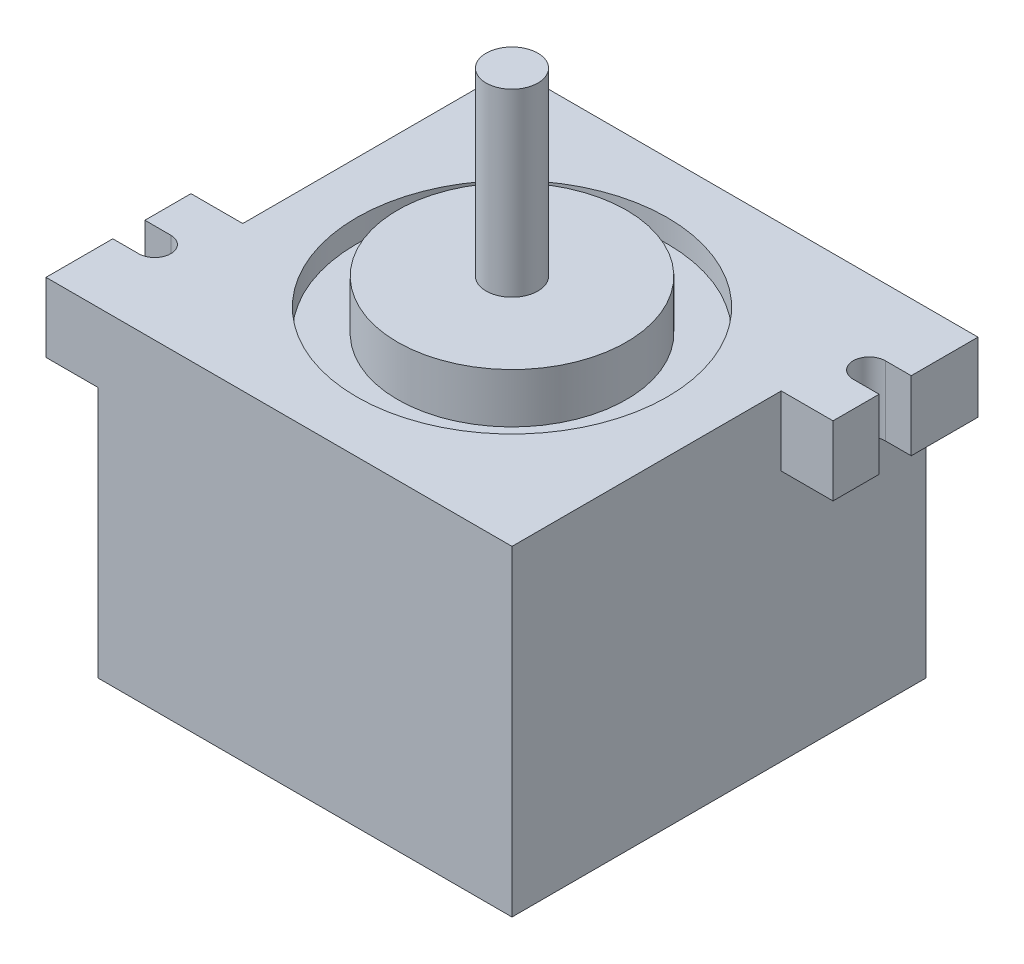
ISO-10303-21;
HEADER;
FILE_DESCRIPTION(('STEP AP214'),'2;1');
FILE_NAME('part.step','',(''),(''),'','','');
FILE_SCHEMA(('AUTOMOTIVE_DESIGN { 1 0 10303 214 1 1 1 1 }'));
ENDSEC;
DATA;
#1=APPLICATION_CONTEXT('core data for automotive mechanical design processes');
#2=APPLICATION_PROTOCOL_DEFINITION('international standard','automotive_design',2000,#1);
#3=PRODUCT_CONTEXT('',#1,'mechanical');
#4=PRODUCT('Part','Part','',(#3));
#5=PRODUCT_RELATED_PRODUCT_CATEGORY('part','',(#4));
#6=PRODUCT_DEFINITION_FORMATION('','',#4);
#7=PRODUCT_DEFINITION_CONTEXT('part definition',#1,'design');
#8=PRODUCT_DEFINITION('design','',#6,#7);
#9=PRODUCT_DEFINITION_SHAPE('','',#8);
#10=(LENGTH_UNIT() NAMED_UNIT(*) SI_UNIT(.MILLI.,.METRE.));
#11=(NAMED_UNIT(*) PLANE_ANGLE_UNIT() SI_UNIT($,.RADIAN.));
#12=(NAMED_UNIT(*) SI_UNIT($,.STERADIAN.) SOLID_ANGLE_UNIT());
#13=UNCERTAINTY_MEASURE_WITH_UNIT(LENGTH_MEASURE(1.E-05),#10,'distance_accuracy_value','');
#14=(GEOMETRIC_REPRESENTATION_CONTEXT(3) GLOBAL_UNCERTAINTY_ASSIGNED_CONTEXT((#13)) GLOBAL_UNIT_ASSIGNED_CONTEXT((#10,
#11,#12)) REPRESENTATION_CONTEXT('',''));
#15=CARTESIAN_POINT('',(0.,0.,0.));
#16=DIRECTION('',(0.,0.,1.));
#17=DIRECTION('',(1.,0.,0.));
#18=AXIS2_PLACEMENT_3D('',#15,#16,#17);
#19=CARTESIAN_POINT('',(0.,0.,-40.));
#20=DIRECTION('',(0.,-1.,0.));
#21=DIRECTION('',(0.,0.,-1.));
#22=AXIS2_PLACEMENT_3D('',#19,#20,#21);
#23=PLANE('',#22);
#24=DIRECTION('',(0.,0.,1.));
#25=VECTOR('',#24,1.);
#26=CARTESIAN_POINT('',(0.,0.,0.));
#27=LINE('',#26,#25);
#28=CARTESIAN_POINT('',(0.,0.,-40.));
#29=VERTEX_POINT('',#28);
#30=CARTESIAN_POINT('',(0.,0.,0.));
#31=VERTEX_POINT('',#30);
#32=EDGE_CURVE('E367',#29,#31,#27,.T.);
#33=ORIENTED_EDGE('',*,*,#32,.F.);
#34=DIRECTION('',(-1.,0.,0.));
#35=VECTOR('',#34,1.);
#36=CARTESIAN_POINT('',(0.,0.,-40.));
#37=LINE('',#36,#35);
#38=CARTESIAN_POINT('',(40.,0.,-40.));
#39=VERTEX_POINT('',#38);
#40=EDGE_CURVE('E360',#39,#29,#37,.T.);
#41=ORIENTED_EDGE('',*,*,#40,.F.);
#42=DIRECTION('',(0.,0.,-1.));
#43=VECTOR('',#42,1.);
#44=CARTESIAN_POINT('',(40.,0.,0.));
#45=LINE('',#44,#43);
#46=CARTESIAN_POINT('',(40.,0.,0.));
#47=VERTEX_POINT('',#46);
#48=EDGE_CURVE('E362',#47,#39,#45,.T.);
#49=ORIENTED_EDGE('',*,*,#48,.F.);
#50=DIRECTION('',(1.,0.,0.));
#51=VECTOR('',#50,1.);
#52=CARTESIAN_POINT('',(0.,0.,0.));
#53=LINE('',#52,#51);
#54=EDGE_CURVE('E365',#31,#47,#53,.T.);
#55=ORIENTED_EDGE('',*,*,#54,.F.);
#56=EDGE_LOOP('',(#33,#41,#49,#55));
#57=FACE_BOUND('',#56,.T.);
#58=CARTESIAN_POINT('',(20.,0.,-20.));
#59=DIRECTION('',(0.,-1.,0.));
#60=DIRECTION('',(0.,0.,-1.));
#61=AXIS2_PLACEMENT_3D('',#58,#59,#60);
#62=CIRCLE('',#61,2.5);
#63=CARTESIAN_POINT('',(20.,0.,-22.5));
#64=VERTEX_POINT('',#63);
#65=EDGE_CURVE('E459',#64,#64,#62,.T.);
#66=ORIENTED_EDGE('',*,*,#65,.F.);
#67=EDGE_LOOP('',(#66));
#68=FACE_BOUND('',#67,.T.);
#69=ADVANCED_FACE('F38',(#57,#68),#23,.T.);
#70=CARTESIAN_POINT('',(20.,33.6,-20.));
#71=DIRECTION('',(0.,1.,0.));
#72=DIRECTION('',(0.,0.,1.));
#73=AXIS2_PLACEMENT_3D('',#70,#71,#72);
#74=PLANE('',#73);
#75=CARTESIAN_POINT('',(20.,33.6,-20.));
#76=DIRECTION('',(0.,1.,0.));
#77=DIRECTION('',(0.,0.,1.));
#78=AXIS2_PLACEMENT_3D('',#75,#76,#77);
#79=CIRCLE('',#78,11.05);
#80=CARTESIAN_POINT('',(20.,33.6,-8.95));
#81=VERTEX_POINT('',#80);
#82=EDGE_CURVE('E380',#81,#81,#79,.T.);
#83=ORIENTED_EDGE('',*,*,#82,.T.);
#84=EDGE_LOOP('',(#83));
#85=FACE_BOUND('',#84,.T.);
#86=CARTESIAN_POINT('',(20.,33.6,-20.));
#87=DIRECTION('',(0.,1.,0.));
#88=DIRECTION('',(0.,0.,1.));
#89=AXIS2_PLACEMENT_3D('',#86,#87,#88);
#90=CIRCLE('',#89,2.5);
#91=CARTESIAN_POINT('',(20.,33.6,-17.5));
#92=VERTEX_POINT('',#91);
#93=EDGE_CURVE('E310',#92,#92,#90,.T.);
#94=ORIENTED_EDGE('',*,*,#93,.F.);
#95=EDGE_LOOP('',(#94));
#96=FACE_BOUND('',#95,.T.);
#97=ADVANCED_FACE('F418',(#85,#96),#74,.T.);
#98=CARTESIAN_POINT('',(20.,28.8,-20.));
#99=DIRECTION('',(0.,1.,0.));
#100=DIRECTION('',(0.,0.,1.));
#101=AXIS2_PLACEMENT_3D('',#98,#99,#100);
#102=PLANE('',#101);
#103=CARTESIAN_POINT('',(20.,28.8,-20.));
#104=DIRECTION('',(0.,1.,0.));
#105=DIRECTION('',(0.,0.,1.));
#106=AXIS2_PLACEMENT_3D('',#103,#104,#105);
#107=CIRCLE('',#106,15.);
#108=CARTESIAN_POINT('',(20.,28.8,-5.));
#109=VERTEX_POINT('',#108);
#110=EDGE_CURVE('E369',#109,#109,#107,.T.);
#111=ORIENTED_EDGE('',*,*,#110,.T.);
#112=EDGE_LOOP('',(#111));
#113=FACE_BOUND('',#112,.T.);
#114=CARTESIAN_POINT('',(20.,28.8,-20.));
#115=DIRECTION('',(0.,1.,0.));
#116=DIRECTION('',(0.,0.,1.));
#117=AXIS2_PLACEMENT_3D('',#114,#115,#116);
#118=CIRCLE('',#117,11.05);
#119=CARTESIAN_POINT('',(20.,28.8,-8.95));
#120=VERTEX_POINT('',#119);
#121=EDGE_CURVE('E384',#120,#120,#118,.T.);
#122=ORIENTED_EDGE('',*,*,#121,.F.);
#123=EDGE_LOOP('',(#122));
#124=FACE_BOUND('',#123,.T.);
#125=ADVANCED_FACE('F424',(#113,#124),#102,.T.);
#126=CARTESIAN_POINT('',(0.,31.,0.));
#127=DIRECTION('',(1.,0.,0.));
#128=DIRECTION('',(0.,0.,-1.));
#129=AXIS2_PLACEMENT_3D('',#126,#127,#128);
#130=PLANE('',#129);
#131=DIRECTION('',(0.,-1.,0.));
#132=VECTOR('',#131,1.);
#133=CARTESIAN_POINT('',(0.,31.,0.));
#134=LINE('',#133,#132);
#135=CARTESIAN_POINT('',(0.,24.3,0.));
#136=VERTEX_POINT('',#135);
#137=EDGE_CURVE('E11',#136,#31,#134,.T.);
#138=ORIENTED_EDGE('',*,*,#137,.F.);
#139=DIRECTION('',(0.,0.,-1.));
#140=VECTOR('',#139,1.);
#141=CARTESIAN_POINT('',(0.,24.3,0.));
#142=LINE('',#141,#140);
#143=CARTESIAN_POINT('',(0.,24.3,-14.));
#144=VERTEX_POINT('',#143);
#145=EDGE_CURVE('E199',#136,#144,#142,.T.);
#146=ORIENTED_EDGE('',*,*,#145,.T.);
#147=DIRECTION('',(0.,1.,0.));
#148=VECTOR('',#147,1.);
#149=CARTESIAN_POINT('',(0.,24.3,-14.));
#150=LINE('',#149,#148);
#151=CARTESIAN_POINT('',(0.,31.,-14.));
#152=VERTEX_POINT('',#151);
#153=EDGE_CURVE('E183',#144,#152,#150,.T.);
#154=ORIENTED_EDGE('',*,*,#153,.T.);
#155=DIRECTION('',(0.,0.,1.));
#156=VECTOR('',#155,1.);
#157=CARTESIAN_POINT('',(0.,31.,0.));
#158=LINE('',#157,#156);
#159=CARTESIAN_POINT('',(0.,31.,-40.));
#160=VERTEX_POINT('',#159);
#161=EDGE_CURVE('E343',#160,#152,#158,.T.);
#162=ORIENTED_EDGE('',*,*,#161,.F.);
#163=DIRECTION('',(0.,-1.,0.));
#164=VECTOR('',#163,1.);
#165=CARTESIAN_POINT('',(0.,31.,-40.));
#166=LINE('',#165,#164);
#167=EDGE_CURVE('E352',#160,#29,#166,.T.);
#168=ORIENTED_EDGE('',*,*,#167,.T.);
#169=ORIENTED_EDGE('',*,*,#32,.T.);
#170=EDGE_LOOP('',(#138,#146,#154,#162,#168,#169));
#171=FACE_BOUND('',#170,.T.);
#172=ADVANCED_FACE('F40',(#171),#130,.F.);
#173=CARTESIAN_POINT('',(0.,31.,0.));
#174=DIRECTION('',(0.,0.,-1.));
#175=DIRECTION('',(-1.,0.,0.));
#176=AXIS2_PLACEMENT_3D('',#173,#174,#175);
#177=PLANE('',#176);
#178=ORIENTED_EDGE('',*,*,#54,.T.);
#179=DIRECTION('',(0.,-1.,0.));
#180=VECTOR('',#179,1.);
#181=CARTESIAN_POINT('',(40.,31.,0.));
#182=LINE('',#181,#180);
#183=CARTESIAN_POINT('',(40.,31.,0.));
#184=VERTEX_POINT('',#183);
#185=EDGE_CURVE('E48',#184,#47,#182,.T.);
#186=ORIENTED_EDGE('',*,*,#185,.F.);
#187=DIRECTION('',(1.,0.,0.));
#188=VECTOR('',#187,1.);
#189=CARTESIAN_POINT('',(0.,31.,0.));
#190=LINE('',#189,#188);
#191=CARTESIAN_POINT('',(-5.,31.,0.));
#192=VERTEX_POINT('',#191);
#193=EDGE_CURVE('E372',#192,#184,#190,.T.);
#194=ORIENTED_EDGE('',*,*,#193,.F.);
#195=DIRECTION('',(0.,1.,0.));
#196=VECTOR('',#195,1.);
#197=CARTESIAN_POINT('',(-5.,24.3,0.));
#198=LINE('',#197,#196);
#199=CARTESIAN_POINT('',(-5.,24.3,0.));
#200=VERTEX_POINT('',#199);
#201=EDGE_CURVE('E252',#200,#192,#198,.T.);
#202=ORIENTED_EDGE('',*,*,#201,.F.);
#203=DIRECTION('',(1.,0.,0.));
#204=VECTOR('',#203,1.);
#205=CARTESIAN_POINT('',(0.,24.3,0.));
#206=LINE('',#205,#204);
#207=EDGE_CURVE('E193',#200,#136,#206,.T.);
#208=ORIENTED_EDGE('',*,*,#207,.T.);
#209=ORIENTED_EDGE('',*,*,#137,.T.);
#210=EDGE_LOOP('',(#178,#186,#194,#202,#208,#209));
#211=FACE_BOUND('',#210,.T.);
#212=ADVANCED_FACE('F438',(#211),#177,.F.);
#213=CARTESIAN_POINT('',(40.,31.,0.));
#214=DIRECTION('',(-1.,0.,0.));
#215=DIRECTION('',(0.,0.,1.));
#216=AXIS2_PLACEMENT_3D('',#213,#214,#215);
#217=PLANE('',#216);
#218=DIRECTION('',(0.,-1.,0.));
#219=VECTOR('',#218,1.);
#220=CARTESIAN_POINT('',(40.,31.,-40.));
#221=LINE('',#220,#219);
#222=CARTESIAN_POINT('',(40.,24.3,-40.));
#223=VERTEX_POINT('',#222);
#224=EDGE_CURVE('E350',#223,#39,#221,.T.);
#225=ORIENTED_EDGE('',*,*,#224,.F.);
#226=DIRECTION('',(0.,0.,1.));
#227=VECTOR('',#226,1.);
#228=CARTESIAN_POINT('',(40.,24.3,-40.));
#229=LINE('',#228,#227);
#230=CARTESIAN_POINT('',(40.,24.3,-26.));
#231=VERTEX_POINT('',#230);
#232=EDGE_CURVE('E274',#223,#231,#229,.T.);
#233=ORIENTED_EDGE('',*,*,#232,.T.);
#234=DIRECTION('',(0.,1.,0.));
#235=VECTOR('',#234,1.);
#236=CARTESIAN_POINT('',(40.,24.3,-26.));
#237=LINE('',#236,#235);
#238=CARTESIAN_POINT('',(40.,31.,-26.));
#239=VERTEX_POINT('',#238);
#240=EDGE_CURVE('E322',#231,#239,#237,.T.);
#241=ORIENTED_EDGE('',*,*,#240,.T.);
#242=DIRECTION('',(0.,0.,-1.));
#243=VECTOR('',#242,1.);
#244=CARTESIAN_POINT('',(40.,31.,0.));
#245=LINE('',#244,#243);
#246=EDGE_CURVE('E353',#184,#239,#245,.T.);
#247=ORIENTED_EDGE('',*,*,#246,.F.);
#248=ORIENTED_EDGE('',*,*,#185,.T.);
#249=ORIENTED_EDGE('',*,*,#48,.T.);
#250=EDGE_LOOP('',(#225,#233,#241,#247,#248,#249));
#251=FACE_BOUND('',#250,.T.);
#252=ADVANCED_FACE('F435',(#251),#217,.F.);
#253=CARTESIAN_POINT('',(0.,31.,-40.));
#254=DIRECTION('',(0.,0.,1.));
#255=DIRECTION('',(1.,0.,0.));
#256=AXIS2_PLACEMENT_3D('',#253,#254,#255);
#257=PLANE('',#256);
#258=ORIENTED_EDGE('',*,*,#40,.T.);
#259=ORIENTED_EDGE('',*,*,#167,.F.);
#260=DIRECTION('',(-1.,0.,0.));
#261=VECTOR('',#260,1.);
#262=CARTESIAN_POINT('',(0.,31.,-40.));
#263=LINE('',#262,#261);
#264=CARTESIAN_POINT('',(45.,31.,-40.));
#265=VERTEX_POINT('',#264);
#266=EDGE_CURVE('E359',#265,#160,#263,.T.);
#267=ORIENTED_EDGE('',*,*,#266,.F.);
#268=DIRECTION('',(0.,1.,0.));
#269=VECTOR('',#268,1.);
#270=CARTESIAN_POINT('',(45.,24.3,-40.));
#271=LINE('',#270,#269);
#272=CARTESIAN_POINT('',(45.,24.3,-40.));
#273=VERTEX_POINT('',#272);
#274=EDGE_CURVE('E307',#273,#265,#271,.T.);
#275=ORIENTED_EDGE('',*,*,#274,.F.);
#276=DIRECTION('',(-1.,0.,0.));
#277=VECTOR('',#276,1.);
#278=CARTESIAN_POINT('',(40.,24.3,-40.));
#279=LINE('',#278,#277);
#280=EDGE_CURVE('E290',#273,#223,#279,.T.);
#281=ORIENTED_EDGE('',*,*,#280,.T.);
#282=ORIENTED_EDGE('',*,*,#224,.T.);
#283=EDGE_LOOP('',(#258,#259,#267,#275,#281,#282));
#284=FACE_BOUND('',#283,.T.);
#285=ADVANCED_FACE('F432',(#284),#257,.F.);
#286=CARTESIAN_POINT('',(0.,31.,-40.));
#287=DIRECTION('',(0.,-1.,0.));
#288=DIRECTION('',(0.,0.,-1.));
#289=AXIS2_PLACEMENT_3D('',#286,#287,#288);
#290=PLANE('',#289);
#291=CARTESIAN_POINT('',(20.,31.,-20.));
#292=DIRECTION('',(0.,1.,0.));
#293=DIRECTION('',(0.,0.,1.));
#294=AXIS2_PLACEMENT_3D('',#291,#292,#293);
#295=CIRCLE('',#294,15.);
#296=CARTESIAN_POINT('',(20.,31.,-5.));
#297=VERTEX_POINT('',#296);
#298=EDGE_CURVE('E376',#297,#297,#295,.T.);
#299=ORIENTED_EDGE('',*,*,#298,.F.);
#300=EDGE_LOOP('',(#299));
#301=FACE_BOUND('',#300,.T.);
#302=ORIENTED_EDGE('',*,*,#161,.T.);
#303=DIRECTION('',(-1.,0.,0.));
#304=VECTOR('',#303,1.);
#305=CARTESIAN_POINT('',(0.,31.,-14.));
#306=LINE('',#305,#304);
#307=CARTESIAN_POINT('',(-5.,31.,-14.));
#308=VERTEX_POINT('',#307);
#309=EDGE_CURVE('E59',#152,#308,#306,.T.);
#310=ORIENTED_EDGE('',*,*,#309,.T.);
#311=DIRECTION('',(0.,0.,1.));
#312=VECTOR('',#311,1.);
#313=CARTESIAN_POINT('',(-5.,31.,-9.55));
#314=LINE('',#313,#312);
#315=CARTESIAN_POINT('',(-5.,31.,-9.55));
#316=VERTEX_POINT('',#315);
#317=EDGE_CURVE('E237',#308,#316,#314,.T.);
#318=ORIENTED_EDGE('',*,*,#317,.T.);
#319=DIRECTION('',(1.,0.,0.));
#320=VECTOR('',#319,1.);
#321=CARTESIAN_POINT('',(-2.5,31.,-9.55));
#322=LINE('',#321,#320);
#323=CARTESIAN_POINT('',(-2.5,31.,-9.55));
#324=VERTEX_POINT('',#323);
#325=EDGE_CURVE('E241',#316,#324,#322,.T.);
#326=ORIENTED_EDGE('',*,*,#325,.T.);
#327=CARTESIAN_POINT('',(-2.5,31.,-8.));
#328=DIRECTION('',(0.,-1.,0.));
#329=DIRECTION('',(0.,0.,-1.));
#330=AXIS2_PLACEMENT_3D('',#327,#328,#329);
#331=CIRCLE('',#330,1.55);
#332=CARTESIAN_POINT('',(-2.5,31.,-6.45));
#333=VERTEX_POINT('',#332);
#334=EDGE_CURVE('E245',#324,#333,#331,.T.);
#335=ORIENTED_EDGE('',*,*,#334,.T.);
#336=DIRECTION('',(-1.,0.,0.));
#337=VECTOR('',#336,1.);
#338=CARTESIAN_POINT('',(-2.5,31.,-6.45));
#339=LINE('',#338,#337);
#340=CARTESIAN_POINT('',(-5.,31.,-6.45));
#341=VERTEX_POINT('',#340);
#342=EDGE_CURVE('E214',#333,#341,#339,.T.);
#343=ORIENTED_EDGE('',*,*,#342,.T.);
#344=DIRECTION('',(0.,0.,1.));
#345=VECTOR('',#344,1.);
#346=CARTESIAN_POINT('',(-5.,31.,0.));
#347=LINE('',#346,#345);
#348=EDGE_CURVE('E209',#341,#192,#347,.T.);
#349=ORIENTED_EDGE('',*,*,#348,.T.);
#350=ORIENTED_EDGE('',*,*,#193,.T.);
#351=ORIENTED_EDGE('',*,*,#246,.T.);
#352=DIRECTION('',(1.,0.,0.));
#353=VECTOR('',#352,1.);
#354=CARTESIAN_POINT('',(40.,31.,-26.));
#355=LINE('',#354,#353);
#356=CARTESIAN_POINT('',(45.,31.,-26.));
#357=VERTEX_POINT('',#356);
#358=EDGE_CURVE('E70',#239,#357,#355,.T.);
#359=ORIENTED_EDGE('',*,*,#358,.T.);
#360=DIRECTION('',(0.,0.,-1.));
#361=VECTOR('',#360,1.);
#362=CARTESIAN_POINT('',(45.,31.,-30.45));
#363=LINE('',#362,#361);
#364=CARTESIAN_POINT('',(45.,31.,-30.45));
#365=VERTEX_POINT('',#364);
#366=EDGE_CURVE('E291',#357,#365,#363,.T.);
#367=ORIENTED_EDGE('',*,*,#366,.T.);
#368=DIRECTION('',(-1.,0.,0.));
#369=VECTOR('',#368,1.);
#370=CARTESIAN_POINT('',(42.5,31.,-30.45));
#371=LINE('',#370,#369);
#372=CARTESIAN_POINT('',(42.5,31.,-30.45));
#373=VERTEX_POINT('',#372);
#374=EDGE_CURVE('E295',#365,#373,#371,.T.);
#375=ORIENTED_EDGE('',*,*,#374,.T.);
#376=CARTESIAN_POINT('',(42.5,31.,-32.));
#377=DIRECTION('',(0.,-1.,0.));
#378=DIRECTION('',(0.,0.,1.));
#379=AXIS2_PLACEMENT_3D('',#376,#377,#378);
#380=CIRCLE('',#379,1.55);
#381=CARTESIAN_POINT('',(42.5,31.,-33.55));
#382=VERTEX_POINT('',#381);
#383=EDGE_CURVE('E298',#373,#382,#380,.T.);
#384=ORIENTED_EDGE('',*,*,#383,.T.);
#385=DIRECTION('',(1.,0.,0.));
#386=VECTOR('',#385,1.);
#387=CARTESIAN_POINT('',(42.5,31.,-33.55));
#388=LINE('',#387,#386);
#389=CARTESIAN_POINT('',(45.,31.,-33.55));
#390=VERTEX_POINT('',#389);
#391=EDGE_CURVE('E301',#382,#390,#388,.T.);
#392=ORIENTED_EDGE('',*,*,#391,.T.);
#393=DIRECTION('',(0.,0.,-1.));
#394=VECTOR('',#393,1.);
#395=CARTESIAN_POINT('',(45.,31.,-40.));
#396=LINE('',#395,#394);
#397=EDGE_CURVE('E304',#390,#265,#396,.T.);
#398=ORIENTED_EDGE('',*,*,#397,.T.);
#399=ORIENTED_EDGE('',*,*,#266,.T.);
#400=EDGE_LOOP('',(#302,#310,#318,#326,#335,#343,#349,#350,#351,#359,#367,#375,#384,#392,#398,#399));
#401=FACE_BOUND('',#400,.T.);
#402=ADVANCED_FACE('F430',(#301,#401),#290,.F.);
#403=CARTESIAN_POINT('',(20.,28.8,-20.));
#404=DIRECTION('',(0.,1.,0.));
#405=DIRECTION('',(0.,0.,1.));
#406=AXIS2_PLACEMENT_3D('',#403,#404,#405);
#407=CYLINDRICAL_SURFACE('',#406,15.);
#408=ORIENTED_EDGE('',*,*,#110,.F.);
#409=EDGE_LOOP('',(#408));
#410=FACE_BOUND('',#409,.T.);
#411=ORIENTED_EDGE('',*,*,#298,.T.);
#412=EDGE_LOOP('',(#411));
#413=FACE_BOUND('',#412,.T.);
#414=ADVANCED_FACE('F413',(#410,#413),#407,.F.);
#415=CARTESIAN_POINT('',(20.,33.6,-20.));
#416=DIRECTION('',(0.,-1.,0.));
#417=DIRECTION('',(0.,0.,-1.));
#418=AXIS2_PLACEMENT_3D('',#415,#416,#417);
#419=CYLINDRICAL_SURFACE('',#418,11.05);
#420=ORIENTED_EDGE('',*,*,#82,.F.);
#421=EDGE_LOOP('',(#420));
#422=FACE_BOUND('',#421,.T.);
#423=ORIENTED_EDGE('',*,*,#121,.T.);
#424=EDGE_LOOP('',(#423));
#425=FACE_BOUND('',#424,.T.);
#426=ADVANCED_FACE('F405',(#422,#425),#419,.T.);
#427=CARTESIAN_POINT('',(20.,51.,-20.));
#428=DIRECTION('',(0.,-1.,0.));
#429=DIRECTION('',(0.,0.,-1.));
#430=AXIS2_PLACEMENT_3D('',#427,#428,#429);
#431=CYLINDRICAL_SURFACE('',#430,2.5);
#432=CARTESIAN_POINT('',(20.,51.,-20.));
#433=DIRECTION('',(0.,1.,0.));
#434=DIRECTION('',(0.,0.,1.));
#435=AXIS2_PLACEMENT_3D('',#432,#433,#434);
#436=CIRCLE('',#435,2.5);
#437=CARTESIAN_POINT('',(20.,51.,-17.5));
#438=VERTEX_POINT('',#437);
#439=EDGE_CURVE('E325',#438,#438,#436,.T.);
#440=ORIENTED_EDGE('',*,*,#439,.F.);
#441=EDGE_LOOP('',(#440));
#442=FACE_BOUND('',#441,.T.);
#443=ORIENTED_EDGE('',*,*,#93,.T.);
#444=EDGE_LOOP('',(#443));
#445=FACE_BOUND('',#444,.T.);
#446=ADVANCED_FACE('F403',(#442,#445),#431,.T.);
#447=CARTESIAN_POINT('',(20.,51.,-20.));
#448=DIRECTION('',(0.,1.,0.));
#449=DIRECTION('',(0.,0.,1.));
#450=AXIS2_PLACEMENT_3D('',#447,#448,#449);
#451=PLANE('',#450);
#452=ORIENTED_EDGE('',*,*,#439,.T.);
#453=EDGE_LOOP('',(#452));
#454=FACE_BOUND('',#453,.T.);
#455=ADVANCED_FACE('F401',(#454),#451,.T.);
#456=CARTESIAN_POINT('',(45.,24.3,-40.));
#457=DIRECTION('',(1.,0.,0.));
#458=DIRECTION('',(0.,0.,-1.));
#459=AXIS2_PLACEMENT_3D('',#456,#457,#458);
#460=PLANE('',#459);
#461=ORIENTED_EDGE('',*,*,#397,.F.);
#462=DIRECTION('',(0.,1.,0.));
#463=VECTOR('',#462,1.);
#464=CARTESIAN_POINT('',(45.,24.3,-33.55));
#465=LINE('',#464,#463);
#466=CARTESIAN_POINT('',(45.,24.3,-33.55));
#467=VERTEX_POINT('',#466);
#468=EDGE_CURVE('E311',#467,#390,#465,.T.);
#469=ORIENTED_EDGE('',*,*,#468,.F.);
#470=DIRECTION('',(0.,0.,-1.));
#471=VECTOR('',#470,1.);
#472=CARTESIAN_POINT('',(45.,24.3,-40.));
#473=LINE('',#472,#471);
#474=EDGE_CURVE('E287',#467,#273,#473,.T.);
#475=ORIENTED_EDGE('',*,*,#474,.T.);
#476=ORIENTED_EDGE('',*,*,#274,.T.);
#477=EDGE_LOOP('',(#461,#469,#475,#476));
#478=FACE_BOUND('',#477,.T.);
#479=ADVANCED_FACE('F411',(#478),#460,.T.);
#480=CARTESIAN_POINT('',(42.5,24.3,-33.55));
#481=DIRECTION('',(0.,0.,1.));
#482=DIRECTION('',(1.,0.,0.));
#483=AXIS2_PLACEMENT_3D('',#480,#481,#482);
#484=PLANE('',#483);
#485=ORIENTED_EDGE('',*,*,#391,.F.);
#486=DIRECTION('',(0.,1.,0.));
#487=VECTOR('',#486,1.);
#488=CARTESIAN_POINT('',(42.5,24.3,-33.55));
#489=LINE('',#488,#487);
#490=CARTESIAN_POINT('',(42.5,24.3,-33.55));
#491=VERTEX_POINT('',#490);
#492=EDGE_CURVE('E313',#491,#382,#489,.T.);
#493=ORIENTED_EDGE('',*,*,#492,.F.);
#494=DIRECTION('',(1.,0.,0.));
#495=VECTOR('',#494,1.);
#496=CARTESIAN_POINT('',(42.5,24.3,-33.55));
#497=LINE('',#496,#495);
#498=EDGE_CURVE('E284',#491,#467,#497,.T.);
#499=ORIENTED_EDGE('',*,*,#498,.T.);
#500=ORIENTED_EDGE('',*,*,#468,.T.);
#501=EDGE_LOOP('',(#485,#493,#499,#500));
#502=FACE_BOUND('',#501,.T.);
#503=ADVANCED_FACE('F618',(#502),#484,.T.);
#504=CARTESIAN_POINT('',(42.5,24.3,-32.));
#505=DIRECTION('',(0.,1.,0.));
#506=DIRECTION('',(0.,0.,1.));
#507=AXIS2_PLACEMENT_3D('',#504,#505,#506);
#508=CYLINDRICAL_SURFACE('',#507,1.55);
#509=ORIENTED_EDGE('',*,*,#383,.F.);
#510=DIRECTION('',(0.,1.,0.));
#511=VECTOR('',#510,1.);
#512=CARTESIAN_POINT('',(42.5,24.3,-30.45));
#513=LINE('',#512,#511);
#514=CARTESIAN_POINT('',(42.5,24.3,-30.45));
#515=VERTEX_POINT('',#514);
#516=EDGE_CURVE('E315',#515,#373,#513,.T.);
#517=ORIENTED_EDGE('',*,*,#516,.F.);
#518=CARTESIAN_POINT('',(42.5,24.3,-32.));
#519=DIRECTION('',(0.,-1.,0.));
#520=DIRECTION('',(0.,0.,1.));
#521=AXIS2_PLACEMENT_3D('',#518,#519,#520);
#522=CIRCLE('',#521,1.55);
#523=EDGE_CURVE('E281',#515,#491,#522,.T.);
#524=ORIENTED_EDGE('',*,*,#523,.T.);
#525=ORIENTED_EDGE('',*,*,#492,.T.);
#526=EDGE_LOOP('',(#509,#517,#524,#525));
#527=FACE_BOUND('',#526,.T.);
#528=ADVANCED_FACE('F622',(#527),#508,.F.);
#529=CARTESIAN_POINT('',(42.5,24.3,-30.45));
#530=DIRECTION('',(0.,0.,-1.));
#531=DIRECTION('',(-1.,0.,0.));
#532=AXIS2_PLACEMENT_3D('',#529,#530,#531);
#533=PLANE('',#532);
#534=ORIENTED_EDGE('',*,*,#374,.F.);
#535=DIRECTION('',(0.,1.,0.));
#536=VECTOR('',#535,1.);
#537=CARTESIAN_POINT('',(45.,24.3,-30.45));
#538=LINE('',#537,#536);
#539=CARTESIAN_POINT('',(45.,24.3,-30.45));
#540=VERTEX_POINT('',#539);
#541=EDGE_CURVE('E317',#540,#365,#538,.T.);
#542=ORIENTED_EDGE('',*,*,#541,.F.);
#543=DIRECTION('',(-1.,0.,0.));
#544=VECTOR('',#543,1.);
#545=CARTESIAN_POINT('',(42.5,24.3,-30.45));
#546=LINE('',#545,#544);
#547=EDGE_CURVE('E278',#540,#515,#546,.T.);
#548=ORIENTED_EDGE('',*,*,#547,.T.);
#549=ORIENTED_EDGE('',*,*,#516,.T.);
#550=EDGE_LOOP('',(#534,#542,#548,#549));
#551=FACE_BOUND('',#550,.T.);
#552=ADVANCED_FACE('F626',(#551),#533,.T.);
#553=CARTESIAN_POINT('',(45.,24.3,-30.45));
#554=DIRECTION('',(1.,0.,0.));
#555=DIRECTION('',(0.,0.,-1.));
#556=AXIS2_PLACEMENT_3D('',#553,#554,#555);
#557=PLANE('',#556);
#558=ORIENTED_EDGE('',*,*,#366,.F.);
#559=DIRECTION('',(0.,1.,0.));
#560=VECTOR('',#559,1.);
#561=CARTESIAN_POINT('',(45.,24.3,-26.));
#562=LINE('',#561,#560);
#563=CARTESIAN_POINT('',(45.,24.3,-26.));
#564=VERTEX_POINT('',#563);
#565=EDGE_CURVE('E319',#564,#357,#562,.T.);
#566=ORIENTED_EDGE('',*,*,#565,.F.);
#567=DIRECTION('',(0.,0.,-1.));
#568=VECTOR('',#567,1.);
#569=CARTESIAN_POINT('',(45.,24.3,-30.45));
#570=LINE('',#569,#568);
#571=EDGE_CURVE('E273',#564,#540,#570,.T.);
#572=ORIENTED_EDGE('',*,*,#571,.T.);
#573=ORIENTED_EDGE('',*,*,#541,.T.);
#574=EDGE_LOOP('',(#558,#566,#572,#573));
#575=FACE_BOUND('',#574,.T.);
#576=ADVANCED_FACE('F630',(#575),#557,.T.);
#577=CARTESIAN_POINT('',(40.,24.3,-26.));
#578=DIRECTION('',(0.,0.,1.));
#579=DIRECTION('',(1.,0.,0.));
#580=AXIS2_PLACEMENT_3D('',#577,#578,#579);
#581=PLANE('',#580);
#582=ORIENTED_EDGE('',*,*,#358,.F.);
#583=ORIENTED_EDGE('',*,*,#240,.F.);
#584=DIRECTION('',(1.,0.,0.));
#585=VECTOR('',#584,1.);
#586=CARTESIAN_POINT('',(40.,24.3,-26.));
#587=LINE('',#586,#585);
#588=EDGE_CURVE('E269',#231,#564,#587,.T.);
#589=ORIENTED_EDGE('',*,*,#588,.T.);
#590=ORIENTED_EDGE('',*,*,#565,.T.);
#591=EDGE_LOOP('',(#582,#583,#589,#590));
#592=FACE_BOUND('',#591,.T.);
#593=ADVANCED_FACE('F614',(#592),#581,.T.);
#594=CARTESIAN_POINT('',(42.5,24.3,-32.));
#595=DIRECTION('',(0.,1.,0.));
#596=DIRECTION('',(0.,0.,1.));
#597=AXIS2_PLACEMENT_3D('',#594,#595,#596);
#598=PLANE('',#597);
#599=ORIENTED_EDGE('',*,*,#232,.F.);
#600=ORIENTED_EDGE('',*,*,#280,.F.);
#601=ORIENTED_EDGE('',*,*,#474,.F.);
#602=ORIENTED_EDGE('',*,*,#498,.F.);
#603=ORIENTED_EDGE('',*,*,#523,.F.);
#604=ORIENTED_EDGE('',*,*,#547,.F.);
#605=ORIENTED_EDGE('',*,*,#571,.F.);
#606=ORIENTED_EDGE('',*,*,#588,.F.);
#607=EDGE_LOOP('',(#599,#600,#601,#602,#603,#604,#605,#606));
#608=FACE_BOUND('',#607,.T.);
#609=ADVANCED_FACE('F542',(#608),#598,.F.);
#610=CARTESIAN_POINT('',(-5.,24.3,0.));
#611=DIRECTION('',(-1.,0.,0.));
#612=DIRECTION('',(0.,0.,1.));
#613=AXIS2_PLACEMENT_3D('',#610,#611,#612);
#614=PLANE('',#613);
#615=ORIENTED_EDGE('',*,*,#348,.F.);
#616=DIRECTION('',(0.,1.,0.));
#617=VECTOR('',#616,1.);
#618=CARTESIAN_POINT('',(-5.,24.3,-6.45));
#619=LINE('',#618,#617);
#620=CARTESIAN_POINT('',(-5.,24.3,-6.45));
#621=VERTEX_POINT('',#620);
#622=EDGE_CURVE('E254',#621,#341,#619,.T.);
#623=ORIENTED_EDGE('',*,*,#622,.F.);
#624=DIRECTION('',(0.,0.,1.));
#625=VECTOR('',#624,1.);
#626=CARTESIAN_POINT('',(-5.,24.3,0.));
#627=LINE('',#626,#625);
#628=EDGE_CURVE('E220',#621,#200,#627,.T.);
#629=ORIENTED_EDGE('',*,*,#628,.T.);
#630=ORIENTED_EDGE('',*,*,#201,.T.);
#631=EDGE_LOOP('',(#615,#623,#629,#630));
#632=FACE_BOUND('',#631,.T.);
#633=ADVANCED_FACE('F537',(#632),#614,.T.);
#634=CARTESIAN_POINT('',(-2.5,24.3,-6.45));
#635=DIRECTION('',(0.,0.,-1.));
#636=DIRECTION('',(-1.,0.,0.));
#637=AXIS2_PLACEMENT_3D('',#634,#635,#636);
#638=PLANE('',#637);
#639=ORIENTED_EDGE('',*,*,#342,.F.);
#640=DIRECTION('',(0.,1.,0.));
#641=VECTOR('',#640,1.);
#642=CARTESIAN_POINT('',(-2.5,24.3,-6.45));
#643=LINE('',#642,#641);
#644=CARTESIAN_POINT('',(-2.5,24.3,-6.45));
#645=VERTEX_POINT('',#644);
#646=EDGE_CURVE('E257',#645,#333,#643,.T.);
#647=ORIENTED_EDGE('',*,*,#646,.F.);
#648=DIRECTION('',(-1.,0.,0.));
#649=VECTOR('',#648,1.);
#650=CARTESIAN_POINT('',(-2.5,24.3,-6.45));
#651=LINE('',#650,#649);
#652=EDGE_CURVE('E224',#645,#621,#651,.T.);
#653=ORIENTED_EDGE('',*,*,#652,.T.);
#654=ORIENTED_EDGE('',*,*,#622,.T.);
#655=EDGE_LOOP('',(#639,#647,#653,#654));
#656=FACE_BOUND('',#655,.T.);
#657=ADVANCED_FACE('F541',(#656),#638,.T.);
#658=CARTESIAN_POINT('',(-2.5,24.3,-8.));
#659=DIRECTION('',(0.,1.,0.));
#660=DIRECTION('',(0.,0.,1.));
#661=AXIS2_PLACEMENT_3D('',#658,#659,#660);
#662=CYLINDRICAL_SURFACE('',#661,1.55);
#663=ORIENTED_EDGE('',*,*,#334,.F.);
#664=DIRECTION('',(0.,1.,0.));
#665=VECTOR('',#664,1.);
#666=CARTESIAN_POINT('',(-2.5,24.3,-9.55));
#667=LINE('',#666,#665);
#668=CARTESIAN_POINT('',(-2.5,24.3,-9.55));
#669=VERTEX_POINT('',#668);
#670=EDGE_CURVE('E260',#669,#324,#667,.T.);
#671=ORIENTED_EDGE('',*,*,#670,.F.);
#672=CARTESIAN_POINT('',(-2.5,24.3,-8.));
#673=DIRECTION('',(0.,-1.,0.));
#674=DIRECTION('',(0.,0.,-1.));
#675=AXIS2_PLACEMENT_3D('',#672,#673,#674);
#676=CIRCLE('',#675,1.55);
#677=EDGE_CURVE('E233',#669,#645,#676,.T.);
#678=ORIENTED_EDGE('',*,*,#677,.T.);
#679=ORIENTED_EDGE('',*,*,#646,.T.);
#680=EDGE_LOOP('',(#663,#671,#678,#679));
#681=FACE_BOUND('',#680,.T.);
#682=ADVANCED_FACE('F476',(#681),#662,.F.);
#683=CARTESIAN_POINT('',(-2.5,24.3,-9.55));
#684=DIRECTION('',(0.,0.,1.));
#685=DIRECTION('',(1.,0.,0.));
#686=AXIS2_PLACEMENT_3D('',#683,#684,#685);
#687=PLANE('',#686);
#688=ORIENTED_EDGE('',*,*,#325,.F.);
#689=DIRECTION('',(0.,1.,0.));
#690=VECTOR('',#689,1.);
#691=CARTESIAN_POINT('',(-5.,24.3,-9.55));
#692=LINE('',#691,#690);
#693=CARTESIAN_POINT('',(-5.,24.3,-9.55));
#694=VERTEX_POINT('',#693);
#695=EDGE_CURVE('E263',#694,#316,#692,.T.);
#696=ORIENTED_EDGE('',*,*,#695,.F.);
#697=DIRECTION('',(1.,0.,0.));
#698=VECTOR('',#697,1.);
#699=CARTESIAN_POINT('',(-2.5,24.3,-9.55));
#700=LINE('',#699,#698);
#701=EDGE_CURVE('E468',#694,#669,#700,.T.);
#702=ORIENTED_EDGE('',*,*,#701,.T.);
#703=ORIENTED_EDGE('',*,*,#670,.T.);
#704=EDGE_LOOP('',(#688,#696,#702,#703));
#705=FACE_BOUND('',#704,.T.);
#706=ADVANCED_FACE('F481',(#705),#687,.T.);
#707=CARTESIAN_POINT('',(-5.,24.3,-9.55));
#708=DIRECTION('',(-1.,0.,0.));
#709=DIRECTION('',(0.,0.,1.));
#710=AXIS2_PLACEMENT_3D('',#707,#708,#709);
#711=PLANE('',#710);
#712=ORIENTED_EDGE('',*,*,#317,.F.);
#713=DIRECTION('',(0.,1.,0.));
#714=VECTOR('',#713,1.);
#715=CARTESIAN_POINT('',(-5.,24.3,-14.));
#716=LINE('',#715,#714);
#717=CARTESIAN_POINT('',(-5.,24.3,-14.));
#718=VERTEX_POINT('',#717);
#719=EDGE_CURVE('E192',#718,#308,#716,.T.);
#720=ORIENTED_EDGE('',*,*,#719,.F.);
#721=DIRECTION('',(0.,0.,1.));
#722=VECTOR('',#721,1.);
#723=CARTESIAN_POINT('',(-5.,24.3,-9.55));
#724=LINE('',#723,#722);
#725=EDGE_CURVE('E203',#718,#694,#724,.T.);
#726=ORIENTED_EDGE('',*,*,#725,.T.);
#727=ORIENTED_EDGE('',*,*,#695,.T.);
#728=EDGE_LOOP('',(#712,#720,#726,#727));
#729=FACE_BOUND('',#728,.T.);
#730=ADVANCED_FACE('F484',(#729),#711,.T.);
#731=CARTESIAN_POINT('',(0.,24.3,-14.));
#732=DIRECTION('',(0.,0.,-1.));
#733=DIRECTION('',(-1.,0.,0.));
#734=AXIS2_PLACEMENT_3D('',#731,#732,#733);
#735=PLANE('',#734);
#736=ORIENTED_EDGE('',*,*,#309,.F.);
#737=ORIENTED_EDGE('',*,*,#153,.F.);
#738=DIRECTION('',(-1.,0.,0.));
#739=VECTOR('',#738,1.);
#740=CARTESIAN_POINT('',(0.,24.3,-14.));
#741=LINE('',#740,#739);
#742=EDGE_CURVE('E186',#144,#718,#741,.T.);
#743=ORIENTED_EDGE('',*,*,#742,.T.);
#744=ORIENTED_EDGE('',*,*,#719,.T.);
#745=EDGE_LOOP('',(#736,#737,#743,#744));
#746=FACE_BOUND('',#745,.T.);
#747=ADVANCED_FACE('F185',(#746),#735,.T.);
#748=CARTESIAN_POINT('',(-2.5,24.3,-8.));
#749=DIRECTION('',(0.,1.,0.));
#750=DIRECTION('',(0.,0.,-1.));
#751=AXIS2_PLACEMENT_3D('',#748,#749,#750);
#752=PLANE('',#751);
#753=ORIENTED_EDGE('',*,*,#145,.F.);
#754=ORIENTED_EDGE('',*,*,#207,.F.);
#755=ORIENTED_EDGE('',*,*,#628,.F.);
#756=ORIENTED_EDGE('',*,*,#652,.F.);
#757=ORIENTED_EDGE('',*,*,#677,.F.);
#758=ORIENTED_EDGE('',*,*,#701,.F.);
#759=ORIENTED_EDGE('',*,*,#725,.F.);
#760=ORIENTED_EDGE('',*,*,#742,.F.);
#761=EDGE_LOOP('',(#753,#754,#755,#756,#757,#758,#759,#760));
#762=FACE_BOUND('',#761,.T.);
#763=ADVANCED_FACE('F197',(#762),#752,.F.);
#764=CARTESIAN_POINT('',(20.,-0.5,-20.));
#765=DIRECTION('',(0.,1.,0.));
#766=DIRECTION('',(0.,0.,1.));
#767=AXIS2_PLACEMENT_3D('',#764,#765,#766);
#768=CYLINDRICAL_SURFACE('',#767,2.5);
#769=CARTESIAN_POINT('',(20.,-0.5,-20.));
#770=DIRECTION('',(0.,-1.,0.));
#771=DIRECTION('',(0.,0.,-1.));
#772=AXIS2_PLACEMENT_3D('',#769,#770,#771);
#773=CIRCLE('',#772,2.5);
#774=CARTESIAN_POINT('',(20.,-0.5,-22.5));
#775=VERTEX_POINT('',#774);
#776=EDGE_CURVE('E457',#775,#775,#773,.T.);
#777=ORIENTED_EDGE('',*,*,#776,.F.);
#778=EDGE_LOOP('',(#777));
#779=FACE_BOUND('',#778,.T.);
#780=ORIENTED_EDGE('',*,*,#65,.T.);
#781=EDGE_LOOP('',(#780));
#782=FACE_BOUND('',#781,.T.);
#783=ADVANCED_FACE('F588',(#779,#782),#768,.T.);
#784=CARTESIAN_POINT('',(20.,-0.5,-20.));
#785=DIRECTION('',(0.,-1.,0.));
#786=DIRECTION('',(0.,0.,-1.));
#787=AXIS2_PLACEMENT_3D('',#784,#785,#786);
#788=PLANE('',#787);
#789=ORIENTED_EDGE('',*,*,#776,.T.);
#790=EDGE_LOOP('',(#789));
#791=FACE_BOUND('',#790,.T.);
#792=ADVANCED_FACE('F596',(#791),#788,.T.);
#793=CLOSED_SHELL('',(#69,#97,#125,#172,#212,#252,#285,#402,#414,#426,#446,#455,#479,#503,#528,
#552,#576,#593,#609,#633,#657,#682,#706,#730,#747,#763,#783,#792));
#794=MANIFOLD_SOLID_BREP('B2',#793);
#795=ADVANCED_BREP_SHAPE_REPRESENTATION('',(#18,#794),#14);
#796=SHAPE_DEFINITION_REPRESENTATION(#9,#795);
ENDSEC;
END-ISO-10303-21;
